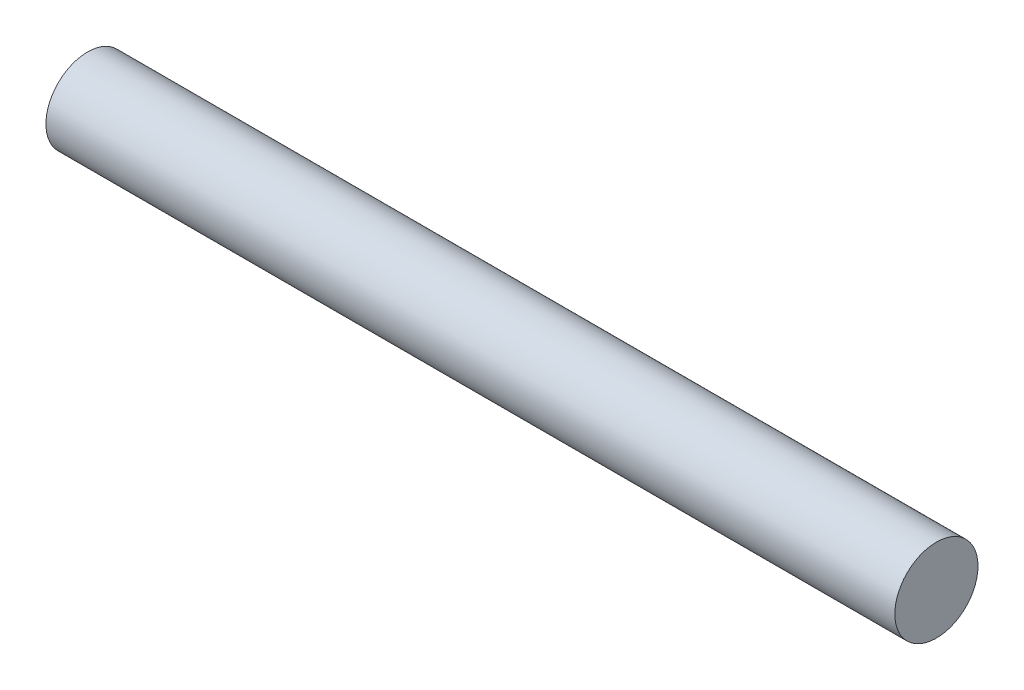
ISO-10303-21;
HEADER;
FILE_DESCRIPTION(('STEP AP214'),'2;1');
FILE_NAME('part.step','',(''),(''),'','','');
FILE_SCHEMA(('AUTOMOTIVE_DESIGN { 1 0 10303 214 1 1 1 1 }'));
ENDSEC;
DATA;
#1=APPLICATION_CONTEXT('core data for automotive mechanical design processes');
#2=APPLICATION_PROTOCOL_DEFINITION('international standard','automotive_design',2000,#1);
#3=PRODUCT_CONTEXT('',#1,'mechanical');
#4=PRODUCT('Part','Part','',(#3));
#5=PRODUCT_RELATED_PRODUCT_CATEGORY('part','',(#4));
#6=PRODUCT_DEFINITION_FORMATION('','',#4);
#7=PRODUCT_DEFINITION_CONTEXT('part definition',#1,'design');
#8=PRODUCT_DEFINITION('design','',#6,#7);
#9=PRODUCT_DEFINITION_SHAPE('','',#8);
#10=(LENGTH_UNIT() NAMED_UNIT(*) SI_UNIT(.MILLI.,.METRE.));
#11=(NAMED_UNIT(*) PLANE_ANGLE_UNIT() SI_UNIT($,.RADIAN.));
#12=(NAMED_UNIT(*) SI_UNIT($,.STERADIAN.) SOLID_ANGLE_UNIT());
#13=UNCERTAINTY_MEASURE_WITH_UNIT(LENGTH_MEASURE(1.E-05),#10,'distance_accuracy_value','');
#14=(GEOMETRIC_REPRESENTATION_CONTEXT(3) GLOBAL_UNCERTAINTY_ASSIGNED_CONTEXT((#13)) GLOBAL_UNIT_ASSIGNED_CONTEXT((#10,
#11,#12)) REPRESENTATION_CONTEXT('',''));
#15=CARTESIAN_POINT('',(0.,0.,0.));
#16=DIRECTION('',(0.,0.,1.));
#17=DIRECTION('',(1.,0.,0.));
#18=AXIS2_PLACEMENT_3D('',#15,#16,#17);
#19=CARTESIAN_POINT('',(100.,0.,0.));
#20=DIRECTION('',(-1.,0.,0.));
#21=DIRECTION('',(0.,0.,1.));
#22=AXIS2_PLACEMENT_3D('',#19,#20,#21);
#23=CYLINDRICAL_SURFACE('',#22,4.9);
#24=CARTESIAN_POINT('',(100.,0.,0.));
#25=DIRECTION('',(1.,0.,0.));
#26=DIRECTION('',(0.,0.,-1.));
#27=AXIS2_PLACEMENT_3D('',#24,#25,#26);
#28=CIRCLE('',#27,4.9);
#29=CARTESIAN_POINT('',(100.,0.,-4.9));
#30=VERTEX_POINT('',#29);
#31=EDGE_CURVE('E11',#30,#30,#28,.T.);
#32=ORIENTED_EDGE('',*,*,#31,.F.);
#33=EDGE_LOOP('',(#32));
#34=FACE_BOUND('',#33,.T.);
#35=CARTESIAN_POINT('',(0.,0.,0.));
#36=DIRECTION('',(1.,0.,0.));
#37=DIRECTION('',(0.,0.,-1.));
#38=AXIS2_PLACEMENT_3D('',#35,#36,#37);
#39=CIRCLE('',#38,4.9);
#40=CARTESIAN_POINT('',(0.,0.,-4.9));
#41=VERTEX_POINT('',#40);
#42=EDGE_CURVE('E45',#41,#41,#39,.T.);
#43=ORIENTED_EDGE('',*,*,#42,.T.);
#44=EDGE_LOOP('',(#43));
#45=FACE_BOUND('',#44,.T.);
#46=ADVANCED_FACE('F42',(#34,#45),#23,.T.);
#47=CARTESIAN_POINT('',(100.,0.,0.));
#48=DIRECTION('',(1.,0.,0.));
#49=DIRECTION('',(0.,0.,-1.));
#50=AXIS2_PLACEMENT_3D('',#47,#48,#49);
#51=PLANE('',#50);
#52=ORIENTED_EDGE('',*,*,#31,.T.);
#53=EDGE_LOOP('',(#52));
#54=FACE_BOUND('',#53,.T.);
#55=ADVANCED_FACE('F134',(#54),#51,.T.);
#56=CARTESIAN_POINT('',(0.,0.,0.));
#57=DIRECTION('',(1.,0.,0.));
#58=DIRECTION('',(0.,0.,-1.));
#59=AXIS2_PLACEMENT_3D('',#56,#57,#58);
#60=PLANE('',#59);
#61=DIRECTION('',(0.,0.,1.));
#62=VECTOR('',#61,1.);
#63=CARTESIAN_POINT('',(0.,-1.85,-1.28062484748657));
#64=LINE('',#63,#62);
#65=CARTESIAN_POINT('',(0.,-1.85,-1.28062484748657));
#66=VERTEX_POINT('',#65);
#67=CARTESIAN_POINT('',(0.,-1.85,1.28062484748657));
#68=VERTEX_POINT('',#67);
#69=EDGE_CURVE('E91',#66,#68,#64,.T.);
#70=ORIENTED_EDGE('',*,*,#69,.F.);
#71=CARTESIAN_POINT('',(0.,0.,0.));
#72=DIRECTION('',(-1.,0.,0.));
#73=DIRECTION('',(0.,0.,1.));
#74=AXIS2_PLACEMENT_3D('',#71,#72,#73);
#75=CIRCLE('',#74,2.25);
#76=CARTESIAN_POINT('',(0.,1.85,-1.28062484748657));
#77=VERTEX_POINT('',#76);
#78=EDGE_CURVE('E56',#77,#66,#75,.T.);
#79=ORIENTED_EDGE('',*,*,#78,.F.);
#80=DIRECTION('',(0.,0.,-1.));
#81=VECTOR('',#80,1.);
#82=CARTESIAN_POINT('',(0.,1.85,-1.28062484748657));
#83=LINE('',#82,#81);
#84=CARTESIAN_POINT('',(0.,1.85,1.28062484748657));
#85=VERTEX_POINT('',#84);
#86=EDGE_CURVE('E107',#85,#77,#83,.T.);
#87=ORIENTED_EDGE('',*,*,#86,.F.);
#88=CARTESIAN_POINT('',(0.,0.,0.));
#89=DIRECTION('',(-1.,0.,0.));
#90=DIRECTION('',(0.,0.,-1.));
#91=AXIS2_PLACEMENT_3D('',#88,#89,#90);
#92=CIRCLE('',#91,2.25);
#93=EDGE_CURVE('E113',#68,#85,#92,.T.);
#94=ORIENTED_EDGE('',*,*,#93,.F.);
#95=EDGE_LOOP('',(#70,#79,#87,#94));
#96=FACE_BOUND('',#95,.T.);
#97=ORIENTED_EDGE('',*,*,#42,.F.);
#98=EDGE_LOOP('',(#97));
#99=FACE_BOUND('',#98,.T.);
#100=ADVANCED_FACE('F119',(#96,#99),#60,.F.);
#101=CARTESIAN_POINT('',(10.,0.,0.));
#102=DIRECTION('',(-1.,0.,0.));
#103=DIRECTION('',(0.,0.,1.));
#104=AXIS2_PLACEMENT_3D('',#101,#102,#103);
#105=CYLINDRICAL_SURFACE('',#104,2.25);
#106=ORIENTED_EDGE('',*,*,#78,.T.);
#107=DIRECTION('',(-1.,0.,0.));
#108=VECTOR('',#107,1.);
#109=CARTESIAN_POINT('',(10.,-1.85,-1.28062484748657));
#110=LINE('',#109,#108);
#111=CARTESIAN_POINT('',(10.,-1.85,-1.28062484748657));
#112=VERTEX_POINT('',#111);
#113=EDGE_CURVE('E79',#112,#66,#110,.T.);
#114=ORIENTED_EDGE('',*,*,#113,.F.);
#115=CARTESIAN_POINT('',(10.,0.,0.));
#116=DIRECTION('',(-1.,0.,0.));
#117=DIRECTION('',(0.,0.,1.));
#118=AXIS2_PLACEMENT_3D('',#115,#116,#117);
#119=CIRCLE('',#118,2.25);
#120=CARTESIAN_POINT('',(10.,1.85,-1.28062484748657));
#121=VERTEX_POINT('',#120);
#122=EDGE_CURVE('E105',#121,#112,#119,.T.);
#123=ORIENTED_EDGE('',*,*,#122,.F.);
#124=DIRECTION('',(-1.,0.,0.));
#125=VECTOR('',#124,1.);
#126=CARTESIAN_POINT('',(10.,1.85,-1.28062484748657));
#127=LINE('',#126,#125);
#128=EDGE_CURVE('E64',#121,#77,#127,.T.);
#129=ORIENTED_EDGE('',*,*,#128,.T.);
#130=EDGE_LOOP('',(#106,#114,#123,#129));
#131=FACE_BOUND('',#130,.T.);
#132=ADVANCED_FACE('F124',(#131),#105,.F.);
#133=CARTESIAN_POINT('',(10.,1.85,-1.28062484748657));
#134=DIRECTION('',(0.,1.,0.));
#135=DIRECTION('',(0.,0.,1.));
#136=AXIS2_PLACEMENT_3D('',#133,#134,#135);
#137=PLANE('',#136);
#138=ORIENTED_EDGE('',*,*,#86,.T.);
#139=ORIENTED_EDGE('',*,*,#128,.F.);
#140=DIRECTION('',(0.,0.,-1.));
#141=VECTOR('',#140,1.);
#142=CARTESIAN_POINT('',(10.,1.85,-1.28062484748657));
#143=LINE('',#142,#141);
#144=CARTESIAN_POINT('',(10.,1.85,1.28062484748657));
#145=VERTEX_POINT('',#144);
#146=EDGE_CURVE('E102',#145,#121,#143,.T.);
#147=ORIENTED_EDGE('',*,*,#146,.F.);
#148=DIRECTION('',(-1.,0.,0.));
#149=VECTOR('',#148,1.);
#150=CARTESIAN_POINT('',(10.,1.85,1.28062484748657));
#151=LINE('',#150,#149);
#152=EDGE_CURVE('E95',#145,#85,#151,.T.);
#153=ORIENTED_EDGE('',*,*,#152,.T.);
#154=EDGE_LOOP('',(#138,#139,#147,#153));
#155=FACE_BOUND('',#154,.T.);
#156=ADVANCED_FACE('F122',(#155),#137,.F.);
#157=CARTESIAN_POINT('',(10.,0.,0.));
#158=DIRECTION('',(-1.,0.,0.));
#159=DIRECTION('',(0.,0.,1.));
#160=AXIS2_PLACEMENT_3D('',#157,#158,#159);
#161=CYLINDRICAL_SURFACE('',#160,2.25);
#162=ORIENTED_EDGE('',*,*,#93,.T.);
#163=ORIENTED_EDGE('',*,*,#152,.F.);
#164=CARTESIAN_POINT('',(10.,0.,0.));
#165=DIRECTION('',(-1.,0.,0.));
#166=DIRECTION('',(0.,0.,-1.));
#167=AXIS2_PLACEMENT_3D('',#164,#165,#166);
#168=CIRCLE('',#167,2.25);
#169=CARTESIAN_POINT('',(10.,-1.85,1.28062484748657));
#170=VERTEX_POINT('',#169);
#171=EDGE_CURVE('E98',#170,#145,#168,.T.);
#172=ORIENTED_EDGE('',*,*,#171,.F.);
#173=DIRECTION('',(-1.,0.,0.));
#174=VECTOR('',#173,1.);
#175=CARTESIAN_POINT('',(10.,-1.85,1.28062484748657));
#176=LINE('',#175,#174);
#177=EDGE_CURVE('E84',#170,#68,#176,.T.);
#178=ORIENTED_EDGE('',*,*,#177,.T.);
#179=EDGE_LOOP('',(#162,#163,#172,#178));
#180=FACE_BOUND('',#179,.T.);
#181=ADVANCED_FACE('F99',(#180),#161,.F.);
#182=CARTESIAN_POINT('',(10.,-1.85,-1.28062484748657));
#183=DIRECTION('',(0.,-1.,0.));
#184=DIRECTION('',(0.,0.,-1.));
#185=AXIS2_PLACEMENT_3D('',#182,#183,#184);
#186=PLANE('',#185);
#187=ORIENTED_EDGE('',*,*,#69,.T.);
#188=ORIENTED_EDGE('',*,*,#177,.F.);
#189=DIRECTION('',(0.,0.,1.));
#190=VECTOR('',#189,1.);
#191=CARTESIAN_POINT('',(10.,-1.85,-1.28062484748657));
#192=LINE('',#191,#190);
#193=EDGE_CURVE('E88',#112,#170,#192,.T.);
#194=ORIENTED_EDGE('',*,*,#193,.F.);
#195=ORIENTED_EDGE('',*,*,#113,.T.);
#196=EDGE_LOOP('',(#187,#188,#194,#195));
#197=FACE_BOUND('',#196,.T.);
#198=ADVANCED_FACE('F86',(#197),#186,.F.);
#199=CARTESIAN_POINT('',(10.,0.,0.));
#200=DIRECTION('',(-1.,0.,0.));
#201=DIRECTION('',(0.,0.,1.));
#202=AXIS2_PLACEMENT_3D('',#199,#200,#201);
#203=PLANE('',#202);
#204=ORIENTED_EDGE('',*,*,#122,.T.);
#205=ORIENTED_EDGE('',*,*,#193,.T.);
#206=ORIENTED_EDGE('',*,*,#171,.T.);
#207=ORIENTED_EDGE('',*,*,#146,.T.);
#208=EDGE_LOOP('',(#204,#205,#206,#207));
#209=FACE_BOUND('',#208,.T.);
#210=ADVANCED_FACE('F104',(#209),#203,.T.);
#211=CLOSED_SHELL('',(#46,#55,#100,#132,#156,#181,#198,#210));
#212=MANIFOLD_SOLID_BREP('B2',#211);
#213=ADVANCED_BREP_SHAPE_REPRESENTATION('',(#18,#212),#14);
#214=SHAPE_DEFINITION_REPRESENTATION(#9,#213);
ENDSEC;
END-ISO-10303-21;
